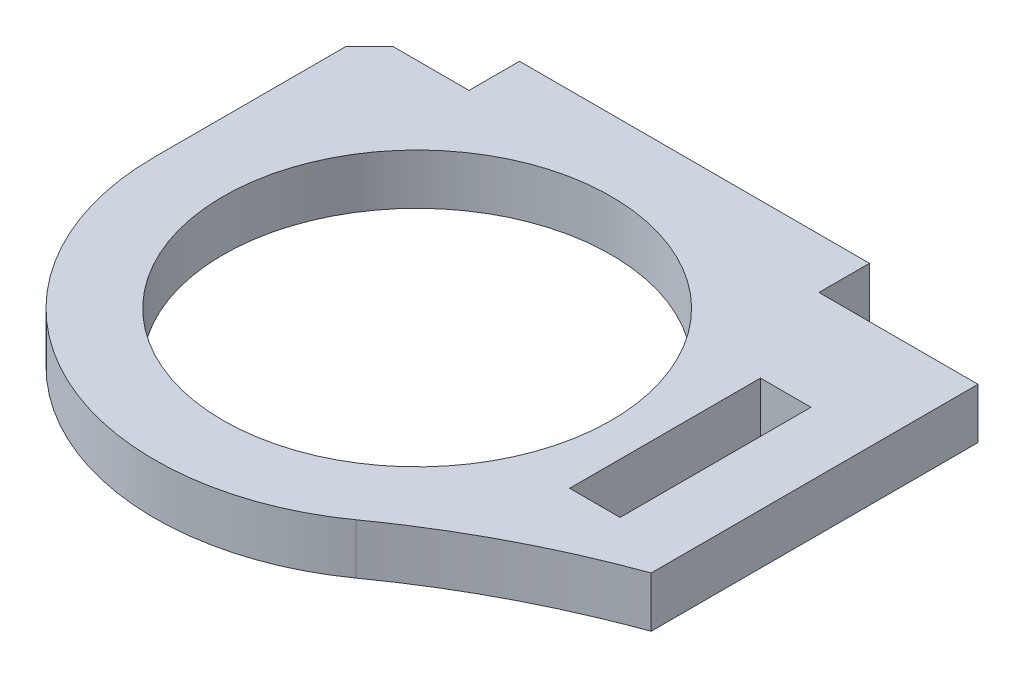
ISO-10303-21;
HEADER;
FILE_DESCRIPTION(('STEP AP214'),'2;1');
FILE_NAME('part.step','',(''),(''),'','','');
FILE_SCHEMA(('AUTOMOTIVE_DESIGN { 1 0 10303 214 1 1 1 1 }'));
ENDSEC;
DATA;
#1=APPLICATION_CONTEXT('core data for automotive mechanical design processes');
#2=APPLICATION_PROTOCOL_DEFINITION('international standard','automotive_design',2000,#1);
#3=PRODUCT_CONTEXT('',#1,'mechanical');
#4=PRODUCT('Part','Part','',(#3));
#5=PRODUCT_RELATED_PRODUCT_CATEGORY('part','',(#4));
#6=PRODUCT_DEFINITION_FORMATION('','',#4);
#7=PRODUCT_DEFINITION_CONTEXT('part definition',#1,'design');
#8=PRODUCT_DEFINITION('design','',#6,#7);
#9=PRODUCT_DEFINITION_SHAPE('','',#8);
#10=(LENGTH_UNIT() NAMED_UNIT(*) SI_UNIT(.MILLI.,.METRE.));
#11=(NAMED_UNIT(*) PLANE_ANGLE_UNIT() SI_UNIT($,.RADIAN.));
#12=(NAMED_UNIT(*) SI_UNIT($,.STERADIAN.) SOLID_ANGLE_UNIT());
#13=UNCERTAINTY_MEASURE_WITH_UNIT(LENGTH_MEASURE(1.E-05),#10,'distance_accuracy_value','');
#14=(GEOMETRIC_REPRESENTATION_CONTEXT(3) GLOBAL_UNCERTAINTY_ASSIGNED_CONTEXT((#13)) GLOBAL_UNIT_ASSIGNED_CONTEXT((#10,
#11,#12)) REPRESENTATION_CONTEXT('',''));
#15=CARTESIAN_POINT('',(0.,0.,0.));
#16=DIRECTION('',(0.,0.,1.));
#17=DIRECTION('',(1.,0.,0.));
#18=AXIS2_PLACEMENT_3D('',#15,#16,#17);
#19=CARTESIAN_POINT('',(0.,0.,-13.5000000004257));
#20=DIRECTION('',(0.,0.,-1.));
#21=DIRECTION('',(-1.,0.,0.));
#22=AXIS2_PLACEMENT_3D('',#19,#20,#21);
#23=PLANE('',#22);
#24=DIRECTION('',(0.,-1.,0.));
#25=VECTOR('',#24,1.);
#26=CARTESIAN_POINT('',(11.7615646299698,3.175,-13.5000000004257));
#27=LINE('',#26,#25);
#28=CARTESIAN_POINT('',(11.7615646299698,3.175,-13.5000000004257));
#29=VERTEX_POINT('',#28);
#30=CARTESIAN_POINT('',(11.7615646299698,0.,-13.5000000004257));
#31=VERTEX_POINT('',#30);
#32=EDGE_CURVE('E296',#29,#31,#27,.T.);
#33=ORIENTED_EDGE('',*,*,#32,.F.);
#34=DIRECTION('',(1.,0.,0.));
#35=VECTOR('',#34,1.);
#36=CARTESIAN_POINT('',(23.375,3.175,-13.5000000004257));
#37=LINE('',#36,#35);
#38=CARTESIAN_POINT('',(21.7615646299698,3.175,-13.5000000004257));
#39=VERTEX_POINT('',#38);
#40=EDGE_CURVE('E323',#29,#39,#37,.T.);
#41=ORIENTED_EDGE('',*,*,#40,.T.);
#42=DIRECTION('',(0.,-1.,0.));
#43=VECTOR('',#42,1.);
#44=CARTESIAN_POINT('',(21.7615646299698,10.,-13.5000000004257));
#45=LINE('',#44,#43);
#46=CARTESIAN_POINT('',(21.7615646299698,0.,-13.5000000004257));
#47=VERTEX_POINT('',#46);
#48=EDGE_CURVE('E311',#39,#47,#45,.T.);
#49=ORIENTED_EDGE('',*,*,#48,.T.);
#50=DIRECTION('',(-1.,0.,0.));
#51=VECTOR('',#50,1.);
#52=CARTESIAN_POINT('',(23.375,0.,-13.5000000004257));
#53=LINE('',#52,#51);
#54=EDGE_CURVE('E319',#47,#31,#53,.T.);
#55=ORIENTED_EDGE('',*,*,#54,.T.);
#56=EDGE_LOOP('',(#33,#41,#49,#55));
#57=FACE_BOUND('',#56,.T.);
#58=ADVANCED_FACE('F167',(#57),#23,.T.);
#59=CARTESIAN_POINT('',(9.59321955864568,-0.15875,13.4246094356453));
#60=CARTESIAN_POINT('',(9.59321955864568,1.00541666666666,13.4246094356453));
#61=CARTESIAN_POINT('',(9.59321955864568,2.16958333333333,13.4246094356453));
#62=CARTESIAN_POINT('',(9.59321955864568,3.33375,13.4246094356453));
#63=CARTESIAN_POINT('',(15.9436300998803,-0.15875,8.88660906389207));
#64=CARTESIAN_POINT('',(15.9436300998803,1.00541666666666,8.88660906389207));
#65=CARTESIAN_POINT('',(15.9436300998803,2.16958333333333,8.88660906389207));
#66=CARTESIAN_POINT('',(15.9436300998803,3.33375,8.88660906389207));
#67=CARTESIAN_POINT('',(23.375,-0.15875,6.49999999999999));
#68=CARTESIAN_POINT('',(23.375,1.00541666666666,6.49999999999999));
#69=CARTESIAN_POINT('',(23.375,2.16958333333333,6.49999999999999));
#70=CARTESIAN_POINT('',(23.375,3.33375,6.49999999999999));
#71=(BOUNDED_SURFACE() B_SPLINE_SURFACE(2,3,((#59,#60,#61,#62),(#63,#64,#65,#66),(#67,#68,#69,
#70)),.UNSPECIFIED.,.F.,.F.,.F.) B_SPLINE_SURFACE_WITH_KNOTS((3,3),(4,4),(0.,1.),(0.00666625,
0.01015875),.UNSPECIFIED.) GEOMETRIC_REPRESENTATION_ITEM() RATIONAL_B_SPLINE_SURFACE(((1.,1.,1.,
1.),(0.988034023302339,0.988034023302339,0.988034023302339,0.988034023302339),(1.,1.,1.,1.))) REPRESENTATION_ITEM('') SURFACE());
#72=CARTESIAN_POINT('',(21.7617507301054,-0.15875,7.04859626398302));
#73=CARTESIAN_POINT('',(21.7617507301054,1.00541666666666,7.04859626398302));
#74=CARTESIAN_POINT('',(21.7617507301054,2.16958333333333,7.04859626398302));
#75=CARTESIAN_POINT('',(21.7617507301054,3.33375,7.04859626398302));
#76=(BOUNDED_CURVE() B_SPLINE_CURVE(3,(#72,#73,#74,#75),.UNSPECIFIED.,.F.,
.F.) B_SPLINE_CURVE_WITH_KNOTS((4,4),(0.00666625,0.01015875),
.UNSPECIFIED.) CURVE() GEOMETRIC_REPRESENTATION_ITEM() RATIONAL_B_SPLINE_CURVE((0.997650559023444,
0.997650559023444,0.997650559023444,0.997650559023444)) REPRESENTATION_ITEM(''));
#77=CARTESIAN_POINT('',(21.7616112285865,3.175,7.04820764438972));
#78=VERTEX_POINT('',#77);
#79=CARTESIAN_POINT('',(21.7616578264769,0.,7.0483371492602));
#80=VERTEX_POINT('',#79);
#81=EDGE_CURVE('E302',#78,#80,#76,.F.);
#82=CARTESIAN_POINT('',(23.375,3.175,6.49999999999999));
#83=CARTESIAN_POINT('',(15.9436300998803,3.175,8.88660906389207));
#84=CARTESIAN_POINT('',(9.59321955864568,3.175,13.4246094356453));
#85=(BOUNDED_CURVE() B_SPLINE_CURVE(2,(#82,#83,#84),.UNSPECIFIED.,.F.,
.F.) B_SPLINE_CURVE_WITH_KNOTS((3,3),(0.,1.),
.UNSPECIFIED.) CURVE() GEOMETRIC_REPRESENTATION_ITEM() RATIONAL_B_SPLINE_CURVE((1.,
0.988034023302339,1.)) REPRESENTATION_ITEM(''));
#86=CARTESIAN_POINT('',(9.59321955864569,3.175,13.4246094356453));
#87=VERTEX_POINT('',#86);
#88=EDGE_CURVE('E584',#87,#78,#85,.F.);
#89=CARTESIAN_POINT('',(9.59321955864568,3.33375,13.4246094356453));
#90=CARTESIAN_POINT('',(9.59321955864568,2.16958333333333,13.4246094356453));
#91=CARTESIAN_POINT('',(9.59321955864568,1.00541666666666,13.4246094356453));
#92=CARTESIAN_POINT('',(9.59321955864568,-0.15875,13.4246094356453));
#93=(BOUNDED_CURVE() B_SPLINE_CURVE(3,(#89,#90,#91,#92),.UNSPECIFIED.,.F.,
.F.) B_SPLINE_CURVE_WITH_KNOTS((4,4),(0.00666625,0.01015875),
.UNSPECIFIED.) CURVE() GEOMETRIC_REPRESENTATION_ITEM() RATIONAL_B_SPLINE_CURVE((1.,1.,1.,1.)) REPRESENTATION_ITEM(''));
#94=CARTESIAN_POINT('',(9.59321955864569,0.,13.4246094356453));
#95=VERTEX_POINT('',#94);
#96=EDGE_CURVE('E587',#95,#87,#93,.F.);
#97=CARTESIAN_POINT('',(9.59321955864568,0.,13.4246094356453));
#98=CARTESIAN_POINT('',(15.9436300998803,0.,8.88660906389207));
#99=CARTESIAN_POINT('',(23.375,0.,6.49999999999999));
#100=(BOUNDED_CURVE() B_SPLINE_CURVE(2,(#97,#98,#99),.UNSPECIFIED.,.F.,
.F.) B_SPLINE_CURVE_WITH_KNOTS((3,3),(0.,1.),
.UNSPECIFIED.) CURVE() GEOMETRIC_REPRESENTATION_ITEM() RATIONAL_B_SPLINE_CURVE((1.,
0.988034023302339,1.)) REPRESENTATION_ITEM(''));
#101=EDGE_CURVE('E551',#80,#95,#100,.F.);
#102=ORIENTED_EDGE('',*,*,#81,.F.);
#103=ORIENTED_EDGE('',*,*,#88,.F.);
#104=ORIENTED_EDGE('',*,*,#96,.F.);
#105=ORIENTED_EDGE('',*,*,#101,.F.);
#106=EDGE_LOOP('',(#102,#103,#104,#105));
#107=FACE_BOUND('',#106,.T.);
#108=ADVANCED_FACE('F383',(#107),#71,.T.);
#109=CARTESIAN_POINT('',(0.,0.,0.));
#110=DIRECTION('',(0.,1.,0.));
#111=DIRECTION('',(0.,0.,1.));
#112=AXIS2_PLACEMENT_3D('',#109,#110,#111);
#113=PLANE('',#112);
#114=CARTESIAN_POINT('',(0.,0.,0.));
#115=DIRECTION('',(0.,1.,0.));
#116=DIRECTION('',(0.,0.,1.));
#117=AXIS2_PLACEMENT_3D('',#114,#115,#116);
#118=CIRCLE('',#117,12.2);
#119=CARTESIAN_POINT('',(0.,0.,12.2));
#120=VERTEX_POINT('',#119);
#121=EDGE_CURVE('E341',#120,#120,#118,.T.);
#122=ORIENTED_EDGE('',*,*,#121,.T.);
#123=EDGE_LOOP('',(#122));
#124=FACE_BOUND('',#123,.T.);
#125=DIRECTION('',(0.,0.,1.));
#126=VECTOR('',#125,1.);
#127=CARTESIAN_POINT('',(17.76156463,0.,-7.00000000042572));
#128=LINE('',#127,#126);
#129=CARTESIAN_POINT('',(17.76156463,0.,-7.00000000042572));
#130=VERTEX_POINT('',#129);
#131=CARTESIAN_POINT('',(17.76156463,0.,4.99999999957428));
#132=VERTEX_POINT('',#131);
#133=EDGE_CURVE('E426',#130,#132,#128,.T.);
#134=ORIENTED_EDGE('',*,*,#133,.F.);
#135=DIRECTION('',(1.,0.,0.));
#136=VECTOR('',#135,1.);
#137=CARTESIAN_POINT('',(14.58656463,0.,-7.00000000042572));
#138=LINE('',#137,#136);
#139=CARTESIAN_POINT('',(14.58656463,0.,-7.00000000042572));
#140=VERTEX_POINT('',#139);
#141=EDGE_CURVE('E431',#140,#130,#138,.T.);
#142=ORIENTED_EDGE('',*,*,#141,.F.);
#143=DIRECTION('',(0.,0.,-1.));
#144=VECTOR('',#143,1.);
#145=CARTESIAN_POINT('',(14.58656463,0.,-7.00000000042572));
#146=LINE('',#145,#144);
#147=CARTESIAN_POINT('',(14.58656463,0.,4.99999999957428));
#148=VERTEX_POINT('',#147);
#149=EDGE_CURVE('E438',#148,#140,#146,.T.);
#150=ORIENTED_EDGE('',*,*,#149,.F.);
#151=DIRECTION('',(-1.,0.,0.));
#152=VECTOR('',#151,1.);
#153=CARTESIAN_POINT('',(14.58656463,0.,4.99999999957428));
#154=LINE('',#153,#152);
#155=EDGE_CURVE('E416',#132,#148,#154,.T.);
#156=ORIENTED_EDGE('',*,*,#155,.F.);
#157=EDGE_LOOP('',(#134,#142,#150,#156));
#158=FACE_BOUND('',#157,.T.);
#159=DIRECTION('',(0.,0.,-1.));
#160=VECTOR('',#159,1.);
#161=CARTESIAN_POINT('',(-16.5,0.,0.));
#162=LINE('',#161,#160);
#163=CARTESIAN_POINT('',(-16.5,0.,0.));
#164=VERTEX_POINT('',#163);
#165=CARTESIAN_POINT('',(-16.5,0.,-12.0000000004257));
#166=VERTEX_POINT('',#165);
#167=EDGE_CURVE('E336',#164,#166,#162,.T.);
#168=ORIENTED_EDGE('',*,*,#167,.T.);
#169=DIRECTION('',(-0.707106781186546,0.,0.707106781186549));
#170=VECTOR('',#169,1.);
#171=CARTESIAN_POINT('',(-15.,0.,-13.5000000004257));
#172=LINE('',#171,#170);
#173=CARTESIAN_POINT('',(-15.,0.,-13.5000000004257));
#174=VERTEX_POINT('',#173);
#175=EDGE_CURVE('E13',#166,#174,#172,.F.);
#176=ORIENTED_EDGE('',*,*,#175,.T.);
#177=CARTESIAN_POINT('',(-10.2384353700302,0.,-13.5000000004257));
#178=VERTEX_POINT('',#177);
#179=EDGE_CURVE('E324',#178,#174,#53,.T.);
#180=ORIENTED_EDGE('',*,*,#179,.F.);
#181=DIRECTION('',(0.,0.,1.));
#182=VECTOR('',#181,1.);
#183=CARTESIAN_POINT('',(-10.2384353700302,0.,-16.6750000004257));
#184=LINE('',#183,#182);
#185=CARTESIAN_POINT('',(-10.2384353700302,0.,-16.6750000004257));
#186=VERTEX_POINT('',#185);
#187=EDGE_CURVE('E279',#186,#178,#184,.T.);
#188=ORIENTED_EDGE('',*,*,#187,.F.);
#189=DIRECTION('',(-1.,0.,0.));
#190=VECTOR('',#189,1.);
#191=CARTESIAN_POINT('',(11.7615646299698,0.,-16.6750000004257));
#192=LINE('',#191,#190);
#193=CARTESIAN_POINT('',(11.7615646299698,0.,-16.6750000004257));
#194=VERTEX_POINT('',#193);
#195=EDGE_CURVE('E270',#194,#186,#192,.T.);
#196=ORIENTED_EDGE('',*,*,#195,.F.);
#197=DIRECTION('',(0.,0.,1.));
#198=VECTOR('',#197,1.);
#199=CARTESIAN_POINT('',(11.7615646299698,0.,-16.6750000004257));
#200=LINE('',#199,#198);
#201=EDGE_CURVE('E275',#194,#31,#200,.T.);
#202=ORIENTED_EDGE('',*,*,#201,.T.);
#203=ORIENTED_EDGE('',*,*,#54,.F.);
#204=DIRECTION('',(0.,0.,-1.));
#205=VECTOR('',#204,1.);
#206=CARTESIAN_POINT('',(21.7615646299698,0.,0.));
#207=LINE('',#206,#205);
#208=EDGE_CURVE('E298',#80,#47,#207,.T.);
#209=ORIENTED_EDGE('',*,*,#208,.F.);
#210=ORIENTED_EDGE('',*,*,#101,.T.);
#211=CARTESIAN_POINT('',(0.,0.,0.));
#212=DIRECTION('',(0.,1.,0.));
#213=DIRECTION('',(0.,0.,1.));
#214=AXIS2_PLACEMENT_3D('',#211,#212,#213);
#215=CIRCLE('',#214,16.5);
#216=EDGE_CURVE('E340',#164,#95,#215,.T.);
#217=ORIENTED_EDGE('',*,*,#216,.F.);
#218=EDGE_LOOP('',(#168,#176,#180,#188,#196,#202,#203,#209,#210,#217));
#219=FACE_BOUND('',#218,.T.);
#220=ADVANCED_FACE('F272',(#124,#158,#219),#113,.F.);
#221=ORIENTED_EDGE('',*,*,#179,.T.);
#222=DIRECTION('',(0.,1.,0.));
#223=VECTOR('',#222,1.);
#224=CARTESIAN_POINT('',(-15.,0.,-13.5000000004257));
#225=LINE('',#224,#223);
#226=CARTESIAN_POINT('',(-15.,3.175,-13.5000000004257));
#227=VERTEX_POINT('',#226);
#228=EDGE_CURVE('E474',#174,#227,#225,.T.);
#229=ORIENTED_EDGE('',*,*,#228,.T.);
#230=CARTESIAN_POINT('',(-10.2384353700302,3.175,-13.5000000004257));
#231=VERTEX_POINT('',#230);
#232=EDGE_CURVE('E327',#227,#231,#37,.T.);
#233=ORIENTED_EDGE('',*,*,#232,.T.);
#234=DIRECTION('',(0.,1.,0.));
#235=VECTOR('',#234,1.);
#236=CARTESIAN_POINT('',(-10.2384353700302,3.175,-13.5000000004257));
#237=LINE('',#236,#235);
#238=EDGE_CURVE('E293',#178,#231,#237,.T.);
#239=ORIENTED_EDGE('',*,*,#238,.F.);
#240=EDGE_LOOP('',(#221,#229,#233,#239));
#241=FACE_BOUND('',#240,.T.);
#242=ADVANCED_FACE('F369',(#241),#23,.T.);
#243=CARTESIAN_POINT('',(0.,3.175,0.));
#244=DIRECTION('',(0.,1.,0.));
#245=DIRECTION('',(0.,0.,1.));
#246=AXIS2_PLACEMENT_3D('',#243,#244,#245);
#247=PLANE('',#246);
#248=ORIENTED_EDGE('',*,*,#232,.F.);
#249=DIRECTION('',(0.707106781186546,0.,-0.707106781186549));
#250=VECTOR('',#249,1.);
#251=CARTESIAN_POINT('',(-14.2500000002129,3.175,-14.2500000002128));
#252=LINE('',#251,#250);
#253=CARTESIAN_POINT('',(-16.5,3.175,-12.0000000004257));
#254=VERTEX_POINT('',#253);
#255=EDGE_CURVE('E191',#227,#254,#252,.F.);
#256=ORIENTED_EDGE('',*,*,#255,.T.);
#257=DIRECTION('',(0.,0.,-1.));
#258=VECTOR('',#257,1.);
#259=CARTESIAN_POINT('',(-16.5,3.175,0.));
#260=LINE('',#259,#258);
#261=CARTESIAN_POINT('',(-16.5,3.175,0.));
#262=VERTEX_POINT('',#261);
#263=EDGE_CURVE('E356',#262,#254,#260,.T.);
#264=ORIENTED_EDGE('',*,*,#263,.F.);
#265=CARTESIAN_POINT('',(0.,3.175,0.));
#266=DIRECTION('',(0.,1.,0.));
#267=DIRECTION('',(0.,0.,1.));
#268=AXIS2_PLACEMENT_3D('',#265,#266,#267);
#269=CIRCLE('',#268,16.5);
#270=EDGE_CURVE('E353',#262,#87,#269,.T.);
#271=ORIENTED_EDGE('',*,*,#270,.T.);
#272=ORIENTED_EDGE('',*,*,#88,.T.);
#273=DIRECTION('',(0.,0.,1.));
#274=VECTOR('',#273,1.);
#275=CARTESIAN_POINT('',(21.7615646299698,3.175,0.));
#276=LINE('',#275,#274);
#277=EDGE_CURVE('E478',#39,#78,#276,.T.);
#278=ORIENTED_EDGE('',*,*,#277,.F.);
#279=ORIENTED_EDGE('',*,*,#40,.F.);
#280=DIRECTION('',(0.,0.,1.));
#281=VECTOR('',#280,1.);
#282=CARTESIAN_POINT('',(11.7615646299698,3.175,-16.6750000004257));
#283=LINE('',#282,#281);
#284=CARTESIAN_POINT('',(11.7615646299698,3.175,-16.6750000004257));
#285=VERTEX_POINT('',#284);
#286=EDGE_CURVE('E822',#285,#29,#283,.T.);
#287=ORIENTED_EDGE('',*,*,#286,.F.);
#288=DIRECTION('',(1.,0.,0.));
#289=VECTOR('',#288,1.);
#290=CARTESIAN_POINT('',(11.7615646299698,3.175,-16.6750000004257));
#291=LINE('',#290,#289);
#292=CARTESIAN_POINT('',(-10.2384353700302,3.175,-16.6750000004257));
#293=VERTEX_POINT('',#292);
#294=EDGE_CURVE('E289',#293,#285,#291,.T.);
#295=ORIENTED_EDGE('',*,*,#294,.F.);
#296=DIRECTION('',(0.,0.,1.));
#297=VECTOR('',#296,1.);
#298=CARTESIAN_POINT('',(-10.2384353700302,3.175,-16.6750000004257));
#299=LINE('',#298,#297);
#300=EDGE_CURVE('E305',#293,#231,#299,.T.);
#301=ORIENTED_EDGE('',*,*,#300,.T.);
#302=EDGE_LOOP('',(#248,#256,#264,#271,#272,#278,#279,#287,#295,#301));
#303=FACE_BOUND('',#302,.T.);
#304=DIRECTION('',(1.,0.,0.));
#305=VECTOR('',#304,1.);
#306=CARTESIAN_POINT('',(14.58656463,3.175,-7.00000000042572));
#307=LINE('',#306,#305);
#308=CARTESIAN_POINT('',(14.58656463,3.175,-7.00000000042572));
#309=VERTEX_POINT('',#308);
#310=CARTESIAN_POINT('',(17.76156463,3.175,-7.00000000042572));
#311=VERTEX_POINT('',#310);
#312=EDGE_CURVE('E425',#309,#311,#307,.T.);
#313=ORIENTED_EDGE('',*,*,#312,.T.);
#314=DIRECTION('',(0.,0.,1.));
#315=VECTOR('',#314,1.);
#316=CARTESIAN_POINT('',(17.76156463,3.175,-7.00000000042572));
#317=LINE('',#316,#315);
#318=CARTESIAN_POINT('',(17.76156463,3.175,4.99999999957427));
#319=VERTEX_POINT('',#318);
#320=EDGE_CURVE('E454',#311,#319,#317,.T.);
#321=ORIENTED_EDGE('',*,*,#320,.T.);
#322=DIRECTION('',(-1.,0.,0.));
#323=VECTOR('',#322,1.);
#324=CARTESIAN_POINT('',(14.58656463,3.175,4.99999999957428));
#325=LINE('',#324,#323);
#326=CARTESIAN_POINT('',(14.58656463,3.175,4.99999999957428));
#327=VERTEX_POINT('',#326);
#328=EDGE_CURVE('E450',#319,#327,#325,.T.);
#329=ORIENTED_EDGE('',*,*,#328,.T.);
#330=DIRECTION('',(0.,0.,-1.));
#331=VECTOR('',#330,1.);
#332=CARTESIAN_POINT('',(14.58656463,3.175,-7.00000000042572));
#333=LINE('',#332,#331);
#334=EDGE_CURVE('E446',#327,#309,#333,.T.);
#335=ORIENTED_EDGE('',*,*,#334,.T.);
#336=EDGE_LOOP('',(#313,#321,#329,#335));
#337=FACE_BOUND('',#336,.T.);
#338=CARTESIAN_POINT('',(0.,3.175,0.));
#339=DIRECTION('',(0.,1.,0.));
#340=DIRECTION('',(0.,0.,1.));
#341=AXIS2_PLACEMENT_3D('',#338,#339,#340);
#342=CIRCLE('',#341,12.2);
#343=CARTESIAN_POINT('',(0.,3.175,12.2));
#344=VERTEX_POINT('',#343);
#345=EDGE_CURVE('E352',#344,#344,#342,.T.);
#346=ORIENTED_EDGE('',*,*,#345,.F.);
#347=EDGE_LOOP('',(#346));
#348=FACE_BOUND('',#347,.T.);
#349=ADVANCED_FACE('F366',(#303,#337,#348),#247,.T.);
#350=CARTESIAN_POINT('',(-16.5,3.175,0.));
#351=DIRECTION('',(-1.,0.,0.));
#352=DIRECTION('',(0.,0.,1.));
#353=AXIS2_PLACEMENT_3D('',#350,#351,#352);
#354=PLANE('',#353);
#355=ORIENTED_EDGE('',*,*,#263,.T.);
#356=DIRECTION('',(0.,-1.,0.));
#357=VECTOR('',#356,1.);
#358=CARTESIAN_POINT('',(-16.5,3.175,-12.0000000004257));
#359=LINE('',#358,#357);
#360=EDGE_CURVE('E177',#254,#166,#359,.T.);
#361=ORIENTED_EDGE('',*,*,#360,.T.);
#362=ORIENTED_EDGE('',*,*,#167,.F.);
#363=DIRECTION('',(0.,-1.,0.));
#364=VECTOR('',#363,1.);
#365=CARTESIAN_POINT('',(-16.5,3.175,0.));
#366=LINE('',#365,#364);
#367=EDGE_CURVE('E346',#262,#164,#366,.T.);
#368=ORIENTED_EDGE('',*,*,#367,.F.);
#369=EDGE_LOOP('',(#355,#361,#362,#368));
#370=FACE_BOUND('',#369,.T.);
#371=ADVANCED_FACE('F368',(#370),#354,.T.);
#372=CARTESIAN_POINT('',(0.,3.175,0.));
#373=DIRECTION('',(0.,-1.,0.));
#374=DIRECTION('',(0.,0.,-1.));
#375=AXIS2_PLACEMENT_3D('',#372,#373,#374);
#376=CYLINDRICAL_SURFACE('',#375,16.5);
#377=ORIENTED_EDGE('',*,*,#216,.T.);
#378=ORIENTED_EDGE('',*,*,#96,.T.);
#379=ORIENTED_EDGE('',*,*,#270,.F.);
#380=ORIENTED_EDGE('',*,*,#367,.T.);
#381=EDGE_LOOP('',(#377,#378,#379,#380));
#382=FACE_BOUND('',#381,.T.);
#383=ADVANCED_FACE('F375',(#382),#376,.T.);
#384=CARTESIAN_POINT('',(0.,3.175,0.));
#385=DIRECTION('',(0.,-1.,0.));
#386=DIRECTION('',(0.,0.,-1.));
#387=AXIS2_PLACEMENT_3D('',#384,#385,#386);
#388=CYLINDRICAL_SURFACE('',#387,12.2);
#389=ORIENTED_EDGE('',*,*,#121,.F.);
#390=EDGE_LOOP('',(#389));
#391=FACE_BOUND('',#390,.T.);
#392=ORIENTED_EDGE('',*,*,#345,.T.);
#393=EDGE_LOOP('',(#392));
#394=FACE_BOUND('',#393,.T.);
#395=ADVANCED_FACE('F364',(#391,#394),#388,.F.);
#396=CARTESIAN_POINT('',(14.58656463,15.5879216947502,-7.00000000042572));
#397=DIRECTION('',(0.,0.,-1.));
#398=DIRECTION('',(-1.,0.,0.));
#399=AXIS2_PLACEMENT_3D('',#396,#397,#398);
#400=PLANE('',#399);
#401=DIRECTION('',(0.,-1.,0.));
#402=VECTOR('',#401,1.);
#403=CARTESIAN_POINT('',(14.58656463,15.5879216947502,-7.00000000042572));
#404=LINE('',#403,#402);
#405=EDGE_CURVE('E325',#309,#140,#404,.T.);
#406=ORIENTED_EDGE('',*,*,#405,.T.);
#407=ORIENTED_EDGE('',*,*,#141,.T.);
#408=DIRECTION('',(0.,-1.,0.));
#409=VECTOR('',#408,1.);
#410=CARTESIAN_POINT('',(17.76156463,15.5879216947502,-7.00000000042572));
#411=LINE('',#410,#409);
#412=EDGE_CURVE('E445',#311,#130,#411,.T.);
#413=ORIENTED_EDGE('',*,*,#412,.F.);
#414=ORIENTED_EDGE('',*,*,#312,.F.);
#415=EDGE_LOOP('',(#406,#407,#413,#414));
#416=FACE_BOUND('',#415,.T.);
#417=ADVANCED_FACE('F390',(#416),#400,.F.);
#418=CARTESIAN_POINT('',(17.76156463,15.5879216947502,-7.00000000042572));
#419=DIRECTION('',(1.,0.,0.));
#420=DIRECTION('',(0.,0.,-1.));
#421=AXIS2_PLACEMENT_3D('',#418,#419,#420);
#422=PLANE('',#421);
#423=ORIENTED_EDGE('',*,*,#412,.T.);
#424=ORIENTED_EDGE('',*,*,#133,.T.);
#425=DIRECTION('',(0.,-1.,0.));
#426=VECTOR('',#425,1.);
#427=CARTESIAN_POINT('',(17.76156463,15.5879216947502,4.99999999957428));
#428=LINE('',#427,#426);
#429=EDGE_CURVE('E453',#319,#132,#428,.T.);
#430=ORIENTED_EDGE('',*,*,#429,.F.);
#431=ORIENTED_EDGE('',*,*,#320,.F.);
#432=EDGE_LOOP('',(#423,#424,#430,#431));
#433=FACE_BOUND('',#432,.T.);
#434=ADVANCED_FACE('F393',(#433),#422,.F.);
#435=CARTESIAN_POINT('',(14.58656463,15.5879216947502,4.99999999957428));
#436=DIRECTION('',(0.,0.,1.));
#437=DIRECTION('',(1.,0.,0.));
#438=AXIS2_PLACEMENT_3D('',#435,#436,#437);
#439=PLANE('',#438);
#440=ORIENTED_EDGE('',*,*,#429,.T.);
#441=ORIENTED_EDGE('',*,*,#155,.T.);
#442=DIRECTION('',(0.,-1.,0.));
#443=VECTOR('',#442,1.);
#444=CARTESIAN_POINT('',(14.58656463,15.5879216947502,4.99999999957428));
#445=LINE('',#444,#443);
#446=EDGE_CURVE('E449',#327,#148,#445,.T.);
#447=ORIENTED_EDGE('',*,*,#446,.F.);
#448=ORIENTED_EDGE('',*,*,#328,.F.);
#449=EDGE_LOOP('',(#440,#441,#447,#448));
#450=FACE_BOUND('',#449,.T.);
#451=ADVANCED_FACE('F397',(#450),#439,.F.);
#452=CARTESIAN_POINT('',(14.58656463,15.5879216947502,-7.00000000042572));
#453=DIRECTION('',(-1.,0.,0.));
#454=DIRECTION('',(0.,0.,1.));
#455=AXIS2_PLACEMENT_3D('',#452,#453,#454);
#456=PLANE('',#455);
#457=ORIENTED_EDGE('',*,*,#446,.T.);
#458=ORIENTED_EDGE('',*,*,#149,.T.);
#459=ORIENTED_EDGE('',*,*,#405,.F.);
#460=ORIENTED_EDGE('',*,*,#334,.F.);
#461=EDGE_LOOP('',(#457,#458,#459,#460));
#462=FACE_BOUND('',#461,.T.);
#463=ADVANCED_FACE('F401',(#462),#456,.F.);
#464=CARTESIAN_POINT('',(21.7615646299698,10.,0.));
#465=DIRECTION('',(-1.,0.,0.));
#466=DIRECTION('',(0.,0.,1.));
#467=AXIS2_PLACEMENT_3D('',#464,#465,#466);
#468=PLANE('',#467);
#469=ORIENTED_EDGE('',*,*,#277,.T.);
#470=ORIENTED_EDGE('',*,*,#81,.T.);
#471=ORIENTED_EDGE('',*,*,#208,.T.);
#472=ORIENTED_EDGE('',*,*,#48,.F.);
#473=EDGE_LOOP('',(#469,#470,#471,#472));
#474=FACE_BOUND('',#473,.T.);
#475=ADVANCED_FACE('F405',(#474),#468,.F.);
#476=CARTESIAN_POINT('',(11.7615646299698,3.175,-16.6750000004257));
#477=DIRECTION('',(-1.,0.,0.));
#478=DIRECTION('',(0.,0.,1.));
#479=AXIS2_PLACEMENT_3D('',#476,#477,#478);
#480=PLANE('',#479);
#481=ORIENTED_EDGE('',*,*,#32,.T.);
#482=ORIENTED_EDGE('',*,*,#201,.F.);
#483=DIRECTION('',(0.,-1.,0.));
#484=VECTOR('',#483,1.);
#485=CARTESIAN_POINT('',(11.7615646299698,3.175,-16.6750000004257));
#486=LINE('',#485,#484);
#487=EDGE_CURVE('E284',#285,#194,#486,.T.);
#488=ORIENTED_EDGE('',*,*,#487,.F.);
#489=ORIENTED_EDGE('',*,*,#286,.T.);
#490=EDGE_LOOP('',(#481,#482,#488,#489));
#491=FACE_BOUND('',#490,.T.);
#492=ADVANCED_FACE('F295',(#491),#480,.F.);
#493=CARTESIAN_POINT('',(-10.2384353700302,3.175,-16.6750000004257));
#494=DIRECTION('',(1.,0.,0.));
#495=DIRECTION('',(0.,1.,0.));
#496=AXIS2_PLACEMENT_3D('',#493,#494,#495);
#497=PLANE('',#496);
#498=ORIENTED_EDGE('',*,*,#238,.T.);
#499=ORIENTED_EDGE('',*,*,#300,.F.);
#500=DIRECTION('',(0.,1.,0.));
#501=VECTOR('',#500,1.);
#502=CARTESIAN_POINT('',(-10.2384353700302,3.175,-16.6750000004257));
#503=LINE('',#502,#501);
#504=EDGE_CURVE('E283',#186,#293,#503,.T.);
#505=ORIENTED_EDGE('',*,*,#504,.F.);
#506=ORIENTED_EDGE('',*,*,#187,.T.);
#507=EDGE_LOOP('',(#498,#499,#505,#506));
#508=FACE_BOUND('',#507,.T.);
#509=ADVANCED_FACE('F627',(#508),#497,.F.);
#510=CARTESIAN_POINT('',(0.,0.,-16.6750000004257));
#511=DIRECTION('',(0.,0.,-1.));
#512=DIRECTION('',(-1.,0.,0.));
#513=AXIS2_PLACEMENT_3D('',#510,#511,#512);
#514=PLANE('',#513);
#515=ORIENTED_EDGE('',*,*,#487,.T.);
#516=ORIENTED_EDGE('',*,*,#195,.T.);
#517=ORIENTED_EDGE('',*,*,#504,.T.);
#518=ORIENTED_EDGE('',*,*,#294,.T.);
#519=EDGE_LOOP('',(#515,#516,#517,#518));
#520=FACE_BOUND('',#519,.T.);
#521=ADVANCED_FACE('F287',(#520),#514,.T.);
#522=CARTESIAN_POINT('',(-15.,0.,-13.5000000004257));
#523=DIRECTION('',(0.707106781186549,0.,0.707106781186546));
#524=DIRECTION('',(0.,1.,0.));
#525=AXIS2_PLACEMENT_3D('',#522,#523,#524);
#526=PLANE('',#525);
#527=ORIENTED_EDGE('',*,*,#175,.F.);
#528=ORIENTED_EDGE('',*,*,#360,.F.);
#529=ORIENTED_EDGE('',*,*,#255,.F.);
#530=ORIENTED_EDGE('',*,*,#228,.F.);
#531=EDGE_LOOP('',(#527,#528,#529,#530));
#532=FACE_BOUND('',#531,.T.);
#533=ADVANCED_FACE('F170',(#532),#526,.F.);
#534=CLOSED_SHELL('',(#58,#108,#220,#242,#349,#371,#383,#395,#417,#434,#451,#463,#475,#492,#509,
#521,#533));
#535=MANIFOLD_SOLID_BREP('B2',#534);
#536=ADVANCED_BREP_SHAPE_REPRESENTATION('',(#18,#535),#14);
#537=SHAPE_DEFINITION_REPRESENTATION(#9,#536);
ENDSEC;
END-ISO-10303-21;
